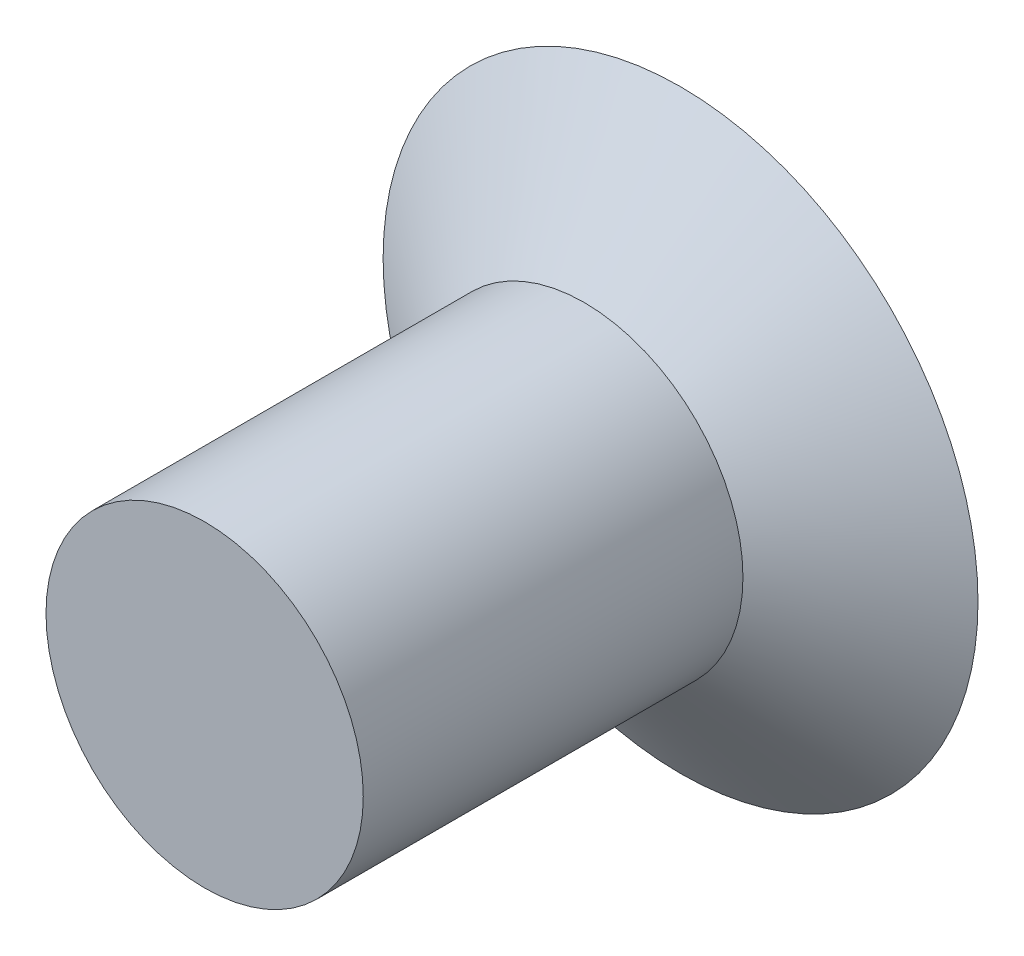
ISO-10303-21;
HEADER;
FILE_DESCRIPTION(('STEP AP214'),'2;1');
FILE_NAME('part.step','',(''),(''),'','','');
FILE_SCHEMA(('AUTOMOTIVE_DESIGN { 1 0 10303 214 1 1 1 1 }'));
ENDSEC;
DATA;
#1=APPLICATION_CONTEXT('core data for automotive mechanical design processes');
#2=APPLICATION_PROTOCOL_DEFINITION('international standard','automotive_design',2000,#1);
#3=PRODUCT_CONTEXT('',#1,'mechanical');
#4=PRODUCT('Part','Part','',(#3));
#5=PRODUCT_RELATED_PRODUCT_CATEGORY('part','',(#4));
#6=PRODUCT_DEFINITION_FORMATION('','',#4);
#7=PRODUCT_DEFINITION_CONTEXT('part definition',#1,'design');
#8=PRODUCT_DEFINITION('design','',#6,#7);
#9=PRODUCT_DEFINITION_SHAPE('','',#8);
#10=(LENGTH_UNIT() NAMED_UNIT(*) SI_UNIT(.MILLI.,.METRE.));
#11=(NAMED_UNIT(*) PLANE_ANGLE_UNIT() SI_UNIT($,.RADIAN.));
#12=(NAMED_UNIT(*) SI_UNIT($,.STERADIAN.) SOLID_ANGLE_UNIT());
#13=UNCERTAINTY_MEASURE_WITH_UNIT(LENGTH_MEASURE(1.E-05),#10,'distance_accuracy_value','');
#14=(GEOMETRIC_REPRESENTATION_CONTEXT(3) GLOBAL_UNCERTAINTY_ASSIGNED_CONTEXT((#13)) GLOBAL_UNIT_ASSIGNED_CONTEXT((#10,
#11,#12)) REPRESENTATION_CONTEXT('',''));
#15=CARTESIAN_POINT('',(0.,0.,0.));
#16=DIRECTION('',(0.,0.,1.));
#17=DIRECTION('',(1.,0.,0.));
#18=AXIS2_PLACEMENT_3D('',#15,#16,#17);
#19=CARTESIAN_POINT('',(0.,0.,6.));
#20=DIRECTION('',(0.,0.,-1.));
#21=DIRECTION('',(-1.,0.,0.));
#22=AXIS2_PLACEMENT_3D('',#19,#20,#21);
#23=CYLINDRICAL_SURFACE('',#22,2.);
#24=CARTESIAN_POINT('',(0.,0.,1.21333333333333));
#25=DIRECTION('',(0.,0.,-1.));
#26=DIRECTION('',(-1.,0.,0.));
#27=AXIS2_PLACEMENT_3D('',#24,#25,#26);
#28=CIRCLE('',#27,2.);
#29=CARTESIAN_POINT('',(-2.,0.,1.21333333333333));
#30=VERTEX_POINT('',#29);
#31=EDGE_CURVE('E36',#30,#30,#28,.F.);
#32=ORIENTED_EDGE('',*,*,#31,.T.);
#33=EDGE_LOOP('',(#32));
#34=FACE_BOUND('',#33,.T.);
#35=CARTESIAN_POINT('',(0.,0.,6.));
#36=DIRECTION('',(0.,0.,1.));
#37=DIRECTION('',(1.,0.,0.));
#38=AXIS2_PLACEMENT_3D('',#35,#36,#37);
#39=CIRCLE('',#38,2.);
#40=CARTESIAN_POINT('',(2.,0.,6.));
#41=VERTEX_POINT('',#40);
#42=EDGE_CURVE('E10',#41,#41,#39,.T.);
#43=ORIENTED_EDGE('',*,*,#42,.F.);
#44=EDGE_LOOP('',(#43));
#45=FACE_BOUND('',#44,.T.);
#46=ADVANCED_FACE('F33',(#34,#45),#23,.T.);
#47=CARTESIAN_POINT('',(0.,0.,6.));
#48=DIRECTION('',(0.,0.,1.));
#49=DIRECTION('',(1.,0.,0.));
#50=AXIS2_PLACEMENT_3D('',#47,#48,#49);
#51=PLANE('',#50);
#52=ORIENTED_EDGE('',*,*,#42,.T.);
#53=EDGE_LOOP('',(#52));
#54=FACE_BOUND('',#53,.T.);
#55=ADVANCED_FACE('F56',(#54),#51,.T.);
#56=CARTESIAN_POINT('',(0.,0.,2.6));
#57=DIRECTION('',(0.,0.,-1.));
#58=DIRECTION('',(-1.,0.,0.));
#59=AXIS2_PLACEMENT_3D('',#56,#57,#58);
#60=CONICAL_SURFACE('',#59,0.,0.964558662607864);
#61=CARTESIAN_POINT('',(0.,0.,0.));
#62=DIRECTION('',(0.,0.,1.));
#63=DIRECTION('',(1.,0.,0.));
#64=AXIS2_PLACEMENT_3D('',#61,#62,#63);
#65=CIRCLE('',#64,3.75);
#66=CARTESIAN_POINT('',(3.75,0.,0.));
#67=VERTEX_POINT('',#66);
#68=EDGE_CURVE('E43',#67,#67,#65,.T.);
#69=ORIENTED_EDGE('',*,*,#68,.T.);
#70=EDGE_LOOP('',(#69));
#71=FACE_BOUND('',#70,.T.);
#72=ORIENTED_EDGE('',*,*,#31,.F.);
#73=EDGE_LOOP('',(#72));
#74=FACE_BOUND('',#73,.T.);
#75=ADVANCED_FACE('F48',(#71,#74),#60,.T.);
#76=CARTESIAN_POINT('',(0.,0.,0.));
#77=DIRECTION('',(0.,0.,1.));
#78=DIRECTION('',(1.,0.,0.));
#79=AXIS2_PLACEMENT_3D('',#76,#77,#78);
#80=PLANE('',#79);
#81=ORIENTED_EDGE('',*,*,#68,.F.);
#82=EDGE_LOOP('',(#81));
#83=FACE_BOUND('',#82,.T.);
#84=ADVANCED_FACE('F51',(#83),#80,.F.);
#85=CLOSED_SHELL('',(#46,#55,#75,#84));
#86=MANIFOLD_SOLID_BREP('B2',#85);
#87=ADVANCED_BREP_SHAPE_REPRESENTATION('',(#18,#86),#14);
#88=SHAPE_DEFINITION_REPRESENTATION(#9,#87);
ENDSEC;
END-ISO-10303-21;
